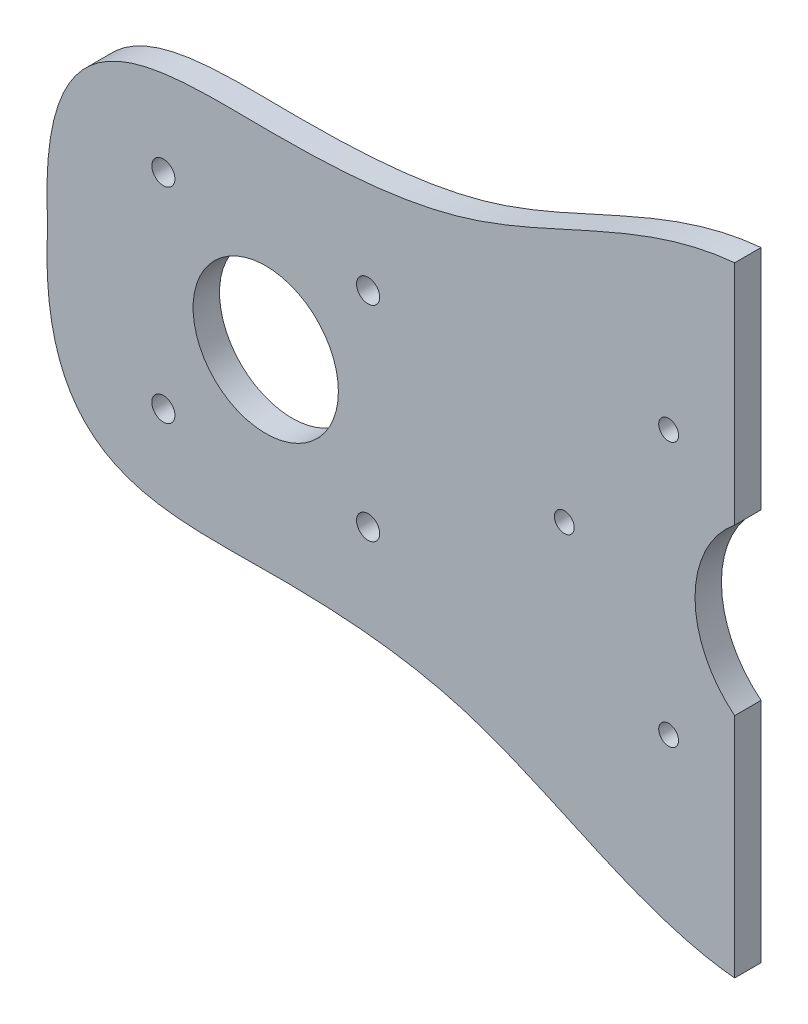
ISO-10303-21;
HEADER;
FILE_DESCRIPTION(('STEP AP214'),'2;1');
FILE_NAME('part.step','',(''),(''),'','','');
FILE_SCHEMA(('AUTOMOTIVE_DESIGN { 1 0 10303 214 1 1 1 1 }'));
ENDSEC;
DATA;
#1=APPLICATION_CONTEXT('core data for automotive mechanical design processes');
#2=APPLICATION_PROTOCOL_DEFINITION('international standard','automotive_design',2000,#1);
#3=PRODUCT_CONTEXT('',#1,'mechanical');
#4=PRODUCT('Part','Part','',(#3));
#5=PRODUCT_RELATED_PRODUCT_CATEGORY('part','',(#4));
#6=PRODUCT_DEFINITION_FORMATION('','',#4);
#7=PRODUCT_DEFINITION_CONTEXT('part definition',#1,'design');
#8=PRODUCT_DEFINITION('design','',#6,#7);
#9=PRODUCT_DEFINITION_SHAPE('','',#8);
#10=(LENGTH_UNIT() NAMED_UNIT(*) SI_UNIT(.MILLI.,.METRE.));
#11=(NAMED_UNIT(*) PLANE_ANGLE_UNIT() SI_UNIT($,.RADIAN.));
#12=(NAMED_UNIT(*) SI_UNIT($,.STERADIAN.) SOLID_ANGLE_UNIT());
#13=UNCERTAINTY_MEASURE_WITH_UNIT(LENGTH_MEASURE(1.E-05),#10,'distance_accuracy_value','');
#14=(GEOMETRIC_REPRESENTATION_CONTEXT(3) GLOBAL_UNCERTAINTY_ASSIGNED_CONTEXT((#13)) GLOBAL_UNIT_ASSIGNED_CONTEXT((#10,
#11,#12)) REPRESENTATION_CONTEXT('',''));
#15=CARTESIAN_POINT('',(0.,0.,0.));
#16=DIRECTION('',(0.,0.,1.));
#17=DIRECTION('',(1.,0.,0.));
#18=AXIS2_PLACEMENT_3D('',#15,#16,#17);
#19=CARTESIAN_POINT('',(-68.5351450306825,-29.2902757208052,4.));
#20=DIRECTION('',(0.,0.,1.));
#21=DIRECTION('',(1.,0.,0.));
#22=AXIS2_PLACEMENT_3D('',#19,#20,#21);
#23=PLANE('',#22);
#24=CARTESIAN_POINT('',(-35.7878056350838,0.,4.));
#25=DIRECTION('',(0.,0.,1.));
#26=DIRECTION('',(1.,0.,0.));
#27=AXIS2_PLACEMENT_3D('',#24,#25,#26);
#28=CIRCLE('',#27,1.5);
#29=CARTESIAN_POINT('',(-34.2878056350838,0.,4.));
#30=VERTEX_POINT('',#29);
#31=EDGE_CURVE('E187',#30,#30,#28,.T.);
#32=ORIENTED_EDGE('',*,*,#31,.F.);
#33=EDGE_LOOP('',(#32));
#34=FACE_BOUND('',#33,.T.);
#35=CARTESIAN_POINT('',(-96.5,-15.5,4.));
#36=DIRECTION('',(0.,0.,1.));
#37=DIRECTION('',(-1.,0.,0.));
#38=AXIS2_PLACEMENT_3D('',#35,#36,#37);
#39=CIRCLE('',#38,1.75);
#40=CARTESIAN_POINT('',(-98.25,-15.5,4.));
#41=VERTEX_POINT('',#40);
#42=EDGE_CURVE('E199',#41,#41,#39,.T.);
#43=ORIENTED_EDGE('',*,*,#42,.F.);
#44=EDGE_LOOP('',(#43));
#45=FACE_BOUND('',#44,.T.);
#46=CARTESIAN_POINT('',(-65.5,15.5,4.));
#47=DIRECTION('',(0.,0.,1.));
#48=DIRECTION('',(1.,0.,0.));
#49=AXIS2_PLACEMENT_3D('',#46,#47,#48);
#50=CIRCLE('',#49,1.75);
#51=CARTESIAN_POINT('',(-63.75,15.5,4.));
#52=VERTEX_POINT('',#51);
#53=EDGE_CURVE('E211',#52,#52,#50,.T.);
#54=ORIENTED_EDGE('',*,*,#53,.F.);
#55=EDGE_LOOP('',(#54));
#56=FACE_BOUND('',#55,.T.);
#57=CARTESIAN_POINT('',(-20.,20.,4.));
#58=DIRECTION('',(0.,0.,1.));
#59=DIRECTION('',(1.,0.,0.));
#60=AXIS2_PLACEMENT_3D('',#57,#58,#59);
#61=CIRCLE('',#60,1.5);
#62=CARTESIAN_POINT('',(-18.5,20.,4.));
#63=VERTEX_POINT('',#62);
#64=EDGE_CURVE('E223',#63,#63,#61,.T.);
#65=ORIENTED_EDGE('',*,*,#64,.F.);
#66=EDGE_LOOP('',(#65));
#67=FACE_BOUND('',#66,.T.);
#68=CARTESIAN_POINT('',(-114.008518426312,0.,4.));
#69=CARTESIAN_POINT('',(-115.783330074731,-30.8075326016895,4.));
#70=CARTESIAN_POINT('',(-86.9613904589982,-27.9227167138953,4.));
#71=CARTESIAN_POINT('',(-50.0998962242788,-30.0606624382164,4.));
#72=CARTESIAN_POINT('',(-28.1675845635271,-42.8611397131964,4.));
#73=CARTESIAN_POINT('',(-14.3692187453674,-46.490133026964,4.));
#74=CARTESIAN_POINT('',(-9.99999999999999,-46.8924409742114,4.));
#75=B_SPLINE_CURVE_WITH_KNOTS('',3,(#68,#69,#70,#71,#72,#73,#74),.UNSPECIFIED.,.F.,.F.,(4,1,1,1,
4),(0.0727816718911146,0.444445728404173,0.67545769368858,0.901402358579021,1.),.UNSPECIFIED.);
#76=CARTESIAN_POINT('',(-114.008518426312,0.,4.));
#77=VERTEX_POINT('',#76);
#78=CARTESIAN_POINT('',(-9.99999999999999,-46.8924409742114,4.));
#79=VERTEX_POINT('',#78);
#80=EDGE_CURVE('E227',#77,#79,#75,.T.);
#81=ORIENTED_EDGE('',*,*,#80,.T.);
#82=DIRECTION('',(0.,1.,0.));
#83=VECTOR('',#82,1.);
#84=CARTESIAN_POINT('',(-10.,-12.4899959967968,4.));
#85=LINE('',#84,#83);
#86=CARTESIAN_POINT('',(-10.,-12.4899959967968,4.));
#87=VERTEX_POINT('',#86);
#88=EDGE_CURVE('E83',#79,#87,#85,.T.);
#89=ORIENTED_EDGE('',*,*,#88,.T.);
#90=CARTESIAN_POINT('',(0.,0.,4.));
#91=DIRECTION('',(0.,0.,-1.));
#92=DIRECTION('',(1.,0.,0.));
#93=AXIS2_PLACEMENT_3D('',#90,#91,#92);
#94=CIRCLE('',#93,16.);
#95=CARTESIAN_POINT('',(-10.,12.4899959967968,4.));
#96=VERTEX_POINT('',#95);
#97=EDGE_CURVE('E87',#87,#96,#94,.T.);
#98=ORIENTED_EDGE('',*,*,#97,.T.);
#99=DIRECTION('',(0.,1.,0.));
#100=VECTOR('',#99,1.);
#101=CARTESIAN_POINT('',(-10.,46.892440974174,4.));
#102=LINE('',#101,#100);
#103=CARTESIAN_POINT('',(-10.,46.892440974174,4.));
#104=VERTEX_POINT('',#103);
#105=EDGE_CURVE('E91',#96,#104,#102,.T.);
#106=ORIENTED_EDGE('',*,*,#105,.T.);
#107=CARTESIAN_POINT('',(-10.,46.892440974174,4.));
#108=CARTESIAN_POINT('',(-14.3692187453674,46.4901330269266,4.));
#109=CARTESIAN_POINT('',(-28.1675845635271,42.8611397132375,4.));
#110=CARTESIAN_POINT('',(-50.0998962242789,30.0606624382015,4.));
#111=CARTESIAN_POINT('',(-86.9613904589982,27.922716713904,4.));
#112=CARTESIAN_POINT('',(-115.783330074731,30.8075326016835,4.));
#113=CARTESIAN_POINT('',(-114.008518426312,0.,4.));
#114=B_SPLINE_CURVE_WITH_KNOTS('',3,(#107,#108,#109,#110,#111,#112,#113),.UNSPECIFIED.,.F.,.F.,
(4,1,1,1,4),(0.0727816718911147,0.171379313312094,0.397323978202535,0.628335943486942,1.),.UNSPECIFIED.);
#115=EDGE_CURVE('E49',#104,#77,#114,.T.);
#116=ORIENTED_EDGE('',*,*,#115,.T.);
#117=EDGE_LOOP('',(#81,#89,#98,#106,#116));
#118=FACE_BOUND('',#117,.T.);
#119=CARTESIAN_POINT('',(-96.5,15.5,4.));
#120=DIRECTION('',(0.,0.,1.));
#121=DIRECTION('',(1.,0.,0.));
#122=AXIS2_PLACEMENT_3D('',#119,#120,#121);
#123=CIRCLE('',#122,1.75);
#124=CARTESIAN_POINT('',(-94.75,15.5,4.));
#125=VERTEX_POINT('',#124);
#126=EDGE_CURVE('E217',#125,#125,#123,.T.);
#127=ORIENTED_EDGE('',*,*,#126,.F.);
#128=EDGE_LOOP('',(#127));
#129=FACE_BOUND('',#128,.T.);
#130=CARTESIAN_POINT('',(-65.5,-15.5,4.));
#131=DIRECTION('',(0.,0.,1.));
#132=DIRECTION('',(-1.,0.,0.));
#133=AXIS2_PLACEMENT_3D('',#130,#131,#132);
#134=CIRCLE('',#133,1.75);
#135=CARTESIAN_POINT('',(-67.25,-15.5,4.));
#136=VERTEX_POINT('',#135);
#137=EDGE_CURVE('E205',#136,#136,#134,.T.);
#138=ORIENTED_EDGE('',*,*,#137,.F.);
#139=EDGE_LOOP('',(#138));
#140=FACE_BOUND('',#139,.T.);
#141=CARTESIAN_POINT('',(-81.,0.,4.));
#142=DIRECTION('',(0.,0.,1.));
#143=DIRECTION('',(1.,0.,0.));
#144=AXIS2_PLACEMENT_3D('',#141,#142,#143);
#145=CIRCLE('',#144,11.);
#146=CARTESIAN_POINT('',(-70.,0.,4.));
#147=VERTEX_POINT('',#146);
#148=EDGE_CURVE('E193',#147,#147,#145,.T.);
#149=ORIENTED_EDGE('',*,*,#148,.F.);
#150=EDGE_LOOP('',(#149));
#151=FACE_BOUND('',#150,.T.);
#152=CARTESIAN_POINT('',(-20.,-20.,4.));
#153=DIRECTION('',(0.,0.,1.));
#154=DIRECTION('',(-1.,0.,0.));
#155=AXIS2_PLACEMENT_3D('',#152,#153,#154);
#156=CIRCLE('',#155,1.5);
#157=CARTESIAN_POINT('',(-21.5,-20.,4.));
#158=VERTEX_POINT('',#157);
#159=EDGE_CURVE('E178',#158,#158,#156,.T.);
#160=ORIENTED_EDGE('',*,*,#159,.F.);
#161=EDGE_LOOP('',(#160));
#162=FACE_BOUND('',#161,.T.);
#163=ADVANCED_FACE('F31',(#34,#45,#56,#67,#118,#129,#140,#151,#162),#23,.T.);
#164=CARTESIAN_POINT('',(-68.5351450306825,-29.2902757208052,0.));
#165=DIRECTION('',(0.,0.,1.));
#166=DIRECTION('',(1.,0.,0.));
#167=AXIS2_PLACEMENT_3D('',#164,#165,#166);
#168=PLANE('',#167);
#169=CARTESIAN_POINT('',(-35.7878056350838,0.,0.));
#170=DIRECTION('',(0.,0.,1.));
#171=DIRECTION('',(1.,0.,0.));
#172=AXIS2_PLACEMENT_3D('',#169,#170,#171);
#173=CIRCLE('',#172,1.5);
#174=CARTESIAN_POINT('',(-34.2878056350838,0.,0.));
#175=VERTEX_POINT('',#174);
#176=EDGE_CURVE('E184',#175,#175,#173,.T.);
#177=ORIENTED_EDGE('',*,*,#176,.T.);
#178=EDGE_LOOP('',(#177));
#179=FACE_BOUND('',#178,.T.);
#180=CARTESIAN_POINT('',(-96.5,-15.5,0.));
#181=DIRECTION('',(0.,0.,1.));
#182=DIRECTION('',(-1.,0.,0.));
#183=AXIS2_PLACEMENT_3D('',#180,#181,#182);
#184=CIRCLE('',#183,1.75);
#185=CARTESIAN_POINT('',(-98.25,-15.5,0.));
#186=VERTEX_POINT('',#185);
#187=EDGE_CURVE('E196',#186,#186,#184,.T.);
#188=ORIENTED_EDGE('',*,*,#187,.T.);
#189=EDGE_LOOP('',(#188));
#190=FACE_BOUND('',#189,.T.);
#191=CARTESIAN_POINT('',(-65.5,15.5,0.));
#192=DIRECTION('',(0.,0.,1.));
#193=DIRECTION('',(1.,0.,0.));
#194=AXIS2_PLACEMENT_3D('',#191,#192,#193);
#195=CIRCLE('',#194,1.75);
#196=CARTESIAN_POINT('',(-63.75,15.5,0.));
#197=VERTEX_POINT('',#196);
#198=EDGE_CURVE('E208',#197,#197,#195,.T.);
#199=ORIENTED_EDGE('',*,*,#198,.T.);
#200=EDGE_LOOP('',(#199));
#201=FACE_BOUND('',#200,.T.);
#202=CARTESIAN_POINT('',(-20.,20.,0.));
#203=DIRECTION('',(0.,0.,1.));
#204=DIRECTION('',(1.,0.,0.));
#205=AXIS2_PLACEMENT_3D('',#202,#203,#204);
#206=CIRCLE('',#205,1.5);
#207=CARTESIAN_POINT('',(-18.5,20.,0.));
#208=VERTEX_POINT('',#207);
#209=EDGE_CURVE('E220',#208,#208,#206,.T.);
#210=ORIENTED_EDGE('',*,*,#209,.T.);
#211=EDGE_LOOP('',(#210));
#212=FACE_BOUND('',#211,.T.);
#213=CARTESIAN_POINT('',(-114.008518426312,0.,0.));
#214=CARTESIAN_POINT('',(-115.783330074731,-30.8075326016895,0.));
#215=CARTESIAN_POINT('',(-86.9613904589982,-27.9227167138953,0.));
#216=CARTESIAN_POINT('',(-50.0998962242788,-30.0606624382164,0.));
#217=CARTESIAN_POINT('',(-28.1675845635271,-42.8611397131964,0.));
#218=CARTESIAN_POINT('',(-14.3692187453674,-46.490133026964,0.));
#219=CARTESIAN_POINT('',(-9.99999999999999,-46.8924409742114,0.));
#220=B_SPLINE_CURVE_WITH_KNOTS('',3,(#213,#214,#215,#216,#217,#218,#219),.UNSPECIFIED.,.F.,.F.,
(4,1,1,1,4),(0.0727816718911146,0.444445728404173,0.67545769368858,0.901402358579021,1.),.UNSPECIFIED.);
#221=CARTESIAN_POINT('',(-114.008518426312,0.,0.));
#222=VERTEX_POINT('',#221);
#223=CARTESIAN_POINT('',(-9.99999999999999,-46.8924409742114,0.));
#224=VERTEX_POINT('',#223);
#225=EDGE_CURVE('E110',#222,#224,#220,.T.);
#226=ORIENTED_EDGE('',*,*,#225,.F.);
#227=CARTESIAN_POINT('',(-10.,46.892440974174,0.));
#228=CARTESIAN_POINT('',(-14.3692187453674,46.4901330269266,0.));
#229=CARTESIAN_POINT('',(-28.1675845635271,42.8611397132375,0.));
#230=CARTESIAN_POINT('',(-50.0998962242789,30.0606624382015,0.));
#231=CARTESIAN_POINT('',(-86.9613904589982,27.922716713904,0.));
#232=CARTESIAN_POINT('',(-115.783330074731,30.8075326016835,0.));
#233=CARTESIAN_POINT('',(-114.008518426312,0.,0.));
#234=B_SPLINE_CURVE_WITH_KNOTS('',3,(#227,#228,#229,#230,#231,#232,#233),.UNSPECIFIED.,.F.,.F.,
(4,1,1,1,4),(0.0727816718911147,0.171379313312094,0.397323978202535,0.628335943486942,1.),.UNSPECIFIED.);
#235=CARTESIAN_POINT('',(-10.,46.892440974174,0.));
#236=VERTEX_POINT('',#235);
#237=EDGE_CURVE('E75',#236,#222,#234,.T.);
#238=ORIENTED_EDGE('',*,*,#237,.F.);
#239=DIRECTION('',(0.,1.,0.));
#240=VECTOR('',#239,1.);
#241=CARTESIAN_POINT('',(-10.,46.892440974174,0.));
#242=LINE('',#241,#240);
#243=CARTESIAN_POINT('',(-10.,12.4899959967968,0.));
#244=VERTEX_POINT('',#243);
#245=EDGE_CURVE('E69',#244,#236,#242,.T.);
#246=ORIENTED_EDGE('',*,*,#245,.F.);
#247=CARTESIAN_POINT('',(0.,0.,0.));
#248=DIRECTION('',(0.,0.,-1.));
#249=DIRECTION('',(1.,0.,0.));
#250=AXIS2_PLACEMENT_3D('',#247,#248,#249);
#251=CIRCLE('',#250,16.);
#252=CARTESIAN_POINT('',(-10.,-12.4899959967968,0.));
#253=VERTEX_POINT('',#252);
#254=EDGE_CURVE('E98',#253,#244,#251,.T.);
#255=ORIENTED_EDGE('',*,*,#254,.F.);
#256=DIRECTION('',(0.,1.,0.));
#257=VECTOR('',#256,1.);
#258=CARTESIAN_POINT('',(-10.,-12.4899959967968,0.));
#259=LINE('',#258,#257);
#260=EDGE_CURVE('E249',#224,#253,#259,.T.);
#261=ORIENTED_EDGE('',*,*,#260,.F.);
#262=EDGE_LOOP('',(#226,#238,#246,#255,#261));
#263=FACE_BOUND('',#262,.T.);
#264=CARTESIAN_POINT('',(-96.5,15.5,0.));
#265=DIRECTION('',(0.,0.,1.));
#266=DIRECTION('',(1.,0.,0.));
#267=AXIS2_PLACEMENT_3D('',#264,#265,#266);
#268=CIRCLE('',#267,1.75);
#269=CARTESIAN_POINT('',(-94.75,15.5,0.));
#270=VERTEX_POINT('',#269);
#271=EDGE_CURVE('E214',#270,#270,#268,.T.);
#272=ORIENTED_EDGE('',*,*,#271,.T.);
#273=EDGE_LOOP('',(#272));
#274=FACE_BOUND('',#273,.T.);
#275=CARTESIAN_POINT('',(-65.5,-15.5,0.));
#276=DIRECTION('',(0.,0.,1.));
#277=DIRECTION('',(-1.,0.,0.));
#278=AXIS2_PLACEMENT_3D('',#275,#276,#277);
#279=CIRCLE('',#278,1.75);
#280=CARTESIAN_POINT('',(-67.25,-15.5,0.));
#281=VERTEX_POINT('',#280);
#282=EDGE_CURVE('E202',#281,#281,#279,.T.);
#283=ORIENTED_EDGE('',*,*,#282,.T.);
#284=EDGE_LOOP('',(#283));
#285=FACE_BOUND('',#284,.T.);
#286=CARTESIAN_POINT('',(-81.,0.,0.));
#287=DIRECTION('',(0.,0.,1.));
#288=DIRECTION('',(1.,0.,0.));
#289=AXIS2_PLACEMENT_3D('',#286,#287,#288);
#290=CIRCLE('',#289,11.);
#291=CARTESIAN_POINT('',(-70.,0.,0.));
#292=VERTEX_POINT('',#291);
#293=EDGE_CURVE('E190',#292,#292,#290,.T.);
#294=ORIENTED_EDGE('',*,*,#293,.T.);
#295=EDGE_LOOP('',(#294));
#296=FACE_BOUND('',#295,.T.);
#297=CARTESIAN_POINT('',(-20.,-20.,0.));
#298=DIRECTION('',(0.,0.,1.));
#299=DIRECTION('',(-1.,0.,0.));
#300=AXIS2_PLACEMENT_3D('',#297,#298,#299);
#301=CIRCLE('',#300,1.5);
#302=CARTESIAN_POINT('',(-21.5,-20.,0.));
#303=VERTEX_POINT('',#302);
#304=EDGE_CURVE('E181',#303,#303,#301,.T.);
#305=ORIENTED_EDGE('',*,*,#304,.T.);
#306=EDGE_LOOP('',(#305));
#307=FACE_BOUND('',#306,.T.);
#308=ADVANCED_FACE('F123',(#179,#190,#201,#212,#263,#274,#285,#296,#307),#168,.F.);
#309=DIRECTION('',(0.,0.,-1.));
#310=VECTOR('',#309,1.);
#311=SURFACE_OF_LINEAR_EXTRUSION('',#75,#310);
#312=ORIENTED_EDGE('',*,*,#225,.T.);
#313=DIRECTION('',(0.,0.,-1.));
#314=VECTOR('',#313,1.);
#315=CARTESIAN_POINT('',(-9.99999999999999,-46.8924409742114,4.));
#316=LINE('',#315,#314);
#317=EDGE_CURVE('E11',#79,#224,#316,.T.);
#318=ORIENTED_EDGE('',*,*,#317,.F.);
#319=ORIENTED_EDGE('',*,*,#80,.F.);
#320=DIRECTION('',(0.,0.,-1.));
#321=VECTOR('',#320,1.);
#322=CARTESIAN_POINT('',(-114.008518426312,0.,4.));
#323=LINE('',#322,#321);
#324=EDGE_CURVE('E103',#77,#222,#323,.T.);
#325=ORIENTED_EDGE('',*,*,#324,.T.);
#326=EDGE_LOOP('',(#312,#318,#319,#325));
#327=FACE_BOUND('',#326,.T.);
#328=ADVANCED_FACE('F33',(#327),#311,.F.);
#329=CARTESIAN_POINT('',(-10.,-12.4899959967968,4.));
#330=DIRECTION('',(-1.,0.,0.));
#331=DIRECTION('',(0.,-1.,0.));
#332=AXIS2_PLACEMENT_3D('',#329,#330,#331);
#333=PLANE('',#332);
#334=ORIENTED_EDGE('',*,*,#260,.T.);
#335=DIRECTION('',(0.,0.,-1.));
#336=VECTOR('',#335,1.);
#337=CARTESIAN_POINT('',(-10.,-12.4899959967968,4.));
#338=LINE('',#337,#336);
#339=EDGE_CURVE('E41',#87,#253,#338,.T.);
#340=ORIENTED_EDGE('',*,*,#339,.F.);
#341=ORIENTED_EDGE('',*,*,#88,.F.);
#342=ORIENTED_EDGE('',*,*,#317,.T.);
#343=EDGE_LOOP('',(#334,#340,#341,#342));
#344=FACE_BOUND('',#343,.T.);
#345=ADVANCED_FACE('F128',(#344),#333,.F.);
#346=CARTESIAN_POINT('',(0.,0.,4.));
#347=DIRECTION('',(0.,0.,-1.));
#348=DIRECTION('',(-1.,0.,0.));
#349=AXIS2_PLACEMENT_3D('',#346,#347,#348);
#350=CYLINDRICAL_SURFACE('',#349,16.);
#351=ORIENTED_EDGE('',*,*,#254,.T.);
#352=DIRECTION('',(0.,0.,-1.));
#353=VECTOR('',#352,1.);
#354=CARTESIAN_POINT('',(-10.,12.4899959967968,4.));
#355=LINE('',#354,#353);
#356=EDGE_CURVE('E95',#96,#244,#355,.T.);
#357=ORIENTED_EDGE('',*,*,#356,.F.);
#358=ORIENTED_EDGE('',*,*,#97,.F.);
#359=ORIENTED_EDGE('',*,*,#339,.T.);
#360=EDGE_LOOP('',(#351,#357,#358,#359));
#361=FACE_BOUND('',#360,.T.);
#362=ADVANCED_FACE('F96',(#361),#350,.F.);
#363=CARTESIAN_POINT('',(-10.,46.892440974174,4.));
#364=DIRECTION('',(-1.,0.,0.));
#365=DIRECTION('',(0.,-1.,0.));
#366=AXIS2_PLACEMENT_3D('',#363,#364,#365);
#367=PLANE('',#366);
#368=ORIENTED_EDGE('',*,*,#245,.T.);
#369=DIRECTION('',(0.,0.,-1.));
#370=VECTOR('',#369,1.);
#371=CARTESIAN_POINT('',(-10.,46.892440974174,4.));
#372=LINE('',#371,#370);
#373=EDGE_CURVE('E99',#104,#236,#372,.T.);
#374=ORIENTED_EDGE('',*,*,#373,.F.);
#375=ORIENTED_EDGE('',*,*,#105,.F.);
#376=ORIENTED_EDGE('',*,*,#356,.T.);
#377=EDGE_LOOP('',(#368,#374,#375,#376));
#378=FACE_BOUND('',#377,.T.);
#379=ADVANCED_FACE('F101',(#378),#367,.F.);
#380=DIRECTION('',(0.,0.,-1.));
#381=VECTOR('',#380,1.);
#382=SURFACE_OF_LINEAR_EXTRUSION('',#114,#381);
#383=ORIENTED_EDGE('',*,*,#237,.T.);
#384=ORIENTED_EDGE('',*,*,#324,.F.);
#385=ORIENTED_EDGE('',*,*,#115,.F.);
#386=ORIENTED_EDGE('',*,*,#373,.T.);
#387=EDGE_LOOP('',(#383,#384,#385,#386));
#388=FACE_BOUND('',#387,.T.);
#389=ADVANCED_FACE('F118',(#388),#382,.F.);
#390=CARTESIAN_POINT('',(-20.,20.,4.));
#391=DIRECTION('',(0.,0.,-1.));
#392=DIRECTION('',(-1.,0.,0.));
#393=AXIS2_PLACEMENT_3D('',#390,#391,#392);
#394=CYLINDRICAL_SURFACE('',#393,1.5);
#395=ORIENTED_EDGE('',*,*,#64,.T.);
#396=EDGE_LOOP('',(#395));
#397=FACE_BOUND('',#396,.T.);
#398=ORIENTED_EDGE('',*,*,#209,.F.);
#399=EDGE_LOOP('',(#398));
#400=FACE_BOUND('',#399,.T.);
#401=ADVANCED_FACE('F122',(#397,#400),#394,.F.);
#402=CARTESIAN_POINT('',(-96.5,15.5,4.));
#403=DIRECTION('',(0.,0.,-1.));
#404=DIRECTION('',(-1.,0.,0.));
#405=AXIS2_PLACEMENT_3D('',#402,#403,#404);
#406=CYLINDRICAL_SURFACE('',#405,1.75);
#407=ORIENTED_EDGE('',*,*,#126,.T.);
#408=EDGE_LOOP('',(#407));
#409=FACE_BOUND('',#408,.T.);
#410=ORIENTED_EDGE('',*,*,#271,.F.);
#411=EDGE_LOOP('',(#410));
#412=FACE_BOUND('',#411,.T.);
#413=ADVANCED_FACE('F145',(#409,#412),#406,.F.);
#414=CARTESIAN_POINT('',(-65.5,15.5,4.));
#415=DIRECTION('',(0.,0.,-1.));
#416=DIRECTION('',(-1.,0.,0.));
#417=AXIS2_PLACEMENT_3D('',#414,#415,#416);
#418=CYLINDRICAL_SURFACE('',#417,1.75);
#419=ORIENTED_EDGE('',*,*,#53,.T.);
#420=EDGE_LOOP('',(#419));
#421=FACE_BOUND('',#420,.T.);
#422=ORIENTED_EDGE('',*,*,#198,.F.);
#423=EDGE_LOOP('',(#422));
#424=FACE_BOUND('',#423,.T.);
#425=ADVANCED_FACE('F149',(#421,#424),#418,.F.);
#426=CARTESIAN_POINT('',(-65.5,-15.5,4.));
#427=DIRECTION('',(0.,0.,-1.));
#428=DIRECTION('',(-1.,0.,0.));
#429=AXIS2_PLACEMENT_3D('',#426,#427,#428);
#430=CYLINDRICAL_SURFACE('',#429,1.75);
#431=ORIENTED_EDGE('',*,*,#137,.T.);
#432=EDGE_LOOP('',(#431));
#433=FACE_BOUND('',#432,.T.);
#434=ORIENTED_EDGE('',*,*,#282,.F.);
#435=EDGE_LOOP('',(#434));
#436=FACE_BOUND('',#435,.T.);
#437=ADVANCED_FACE('F153',(#433,#436),#430,.F.);
#438=CARTESIAN_POINT('',(-96.5,-15.5,4.));
#439=DIRECTION('',(0.,0.,-1.));
#440=DIRECTION('',(-1.,0.,0.));
#441=AXIS2_PLACEMENT_3D('',#438,#439,#440);
#442=CYLINDRICAL_SURFACE('',#441,1.75);
#443=ORIENTED_EDGE('',*,*,#42,.T.);
#444=EDGE_LOOP('',(#443));
#445=FACE_BOUND('',#444,.T.);
#446=ORIENTED_EDGE('',*,*,#187,.F.);
#447=EDGE_LOOP('',(#446));
#448=FACE_BOUND('',#447,.T.);
#449=ADVANCED_FACE('F157',(#445,#448),#442,.F.);
#450=CARTESIAN_POINT('',(-81.,0.,4.));
#451=DIRECTION('',(0.,0.,-1.));
#452=DIRECTION('',(-1.,0.,0.));
#453=AXIS2_PLACEMENT_3D('',#450,#451,#452);
#454=CYLINDRICAL_SURFACE('',#453,11.);
#455=ORIENTED_EDGE('',*,*,#148,.T.);
#456=EDGE_LOOP('',(#455));
#457=FACE_BOUND('',#456,.T.);
#458=ORIENTED_EDGE('',*,*,#293,.F.);
#459=EDGE_LOOP('',(#458));
#460=FACE_BOUND('',#459,.T.);
#461=ADVANCED_FACE('F161',(#457,#460),#454,.F.);
#462=CARTESIAN_POINT('',(-35.7878056350838,0.,4.));
#463=DIRECTION('',(0.,0.,-1.));
#464=DIRECTION('',(-1.,0.,0.));
#465=AXIS2_PLACEMENT_3D('',#462,#463,#464);
#466=CYLINDRICAL_SURFACE('',#465,1.5);
#467=ORIENTED_EDGE('',*,*,#31,.T.);
#468=EDGE_LOOP('',(#467));
#469=FACE_BOUND('',#468,.T.);
#470=ORIENTED_EDGE('',*,*,#176,.F.);
#471=EDGE_LOOP('',(#470));
#472=FACE_BOUND('',#471,.T.);
#473=ADVANCED_FACE('F165',(#469,#472),#466,.F.);
#474=CARTESIAN_POINT('',(-20.,-20.,4.));
#475=DIRECTION('',(0.,0.,-1.));
#476=DIRECTION('',(-1.,0.,0.));
#477=AXIS2_PLACEMENT_3D('',#474,#475,#476);
#478=CYLINDRICAL_SURFACE('',#477,1.5);
#479=ORIENTED_EDGE('',*,*,#159,.T.);
#480=EDGE_LOOP('',(#479));
#481=FACE_BOUND('',#480,.T.);
#482=ORIENTED_EDGE('',*,*,#304,.F.);
#483=EDGE_LOOP('',(#482));
#484=FACE_BOUND('',#483,.T.);
#485=ADVANCED_FACE('F169',(#481,#484),#478,.F.);
#486=CLOSED_SHELL('',(#163,#308,#328,#345,#362,#379,#389,#401,#413,#425,#437,#449,#461,#473,#485));
#487=MANIFOLD_SOLID_BREP('B2',#486);
#488=ADVANCED_BREP_SHAPE_REPRESENTATION('',(#18,#487),#14);
#489=SHAPE_DEFINITION_REPRESENTATION(#9,#488);
ENDSEC;
END-ISO-10303-21;
